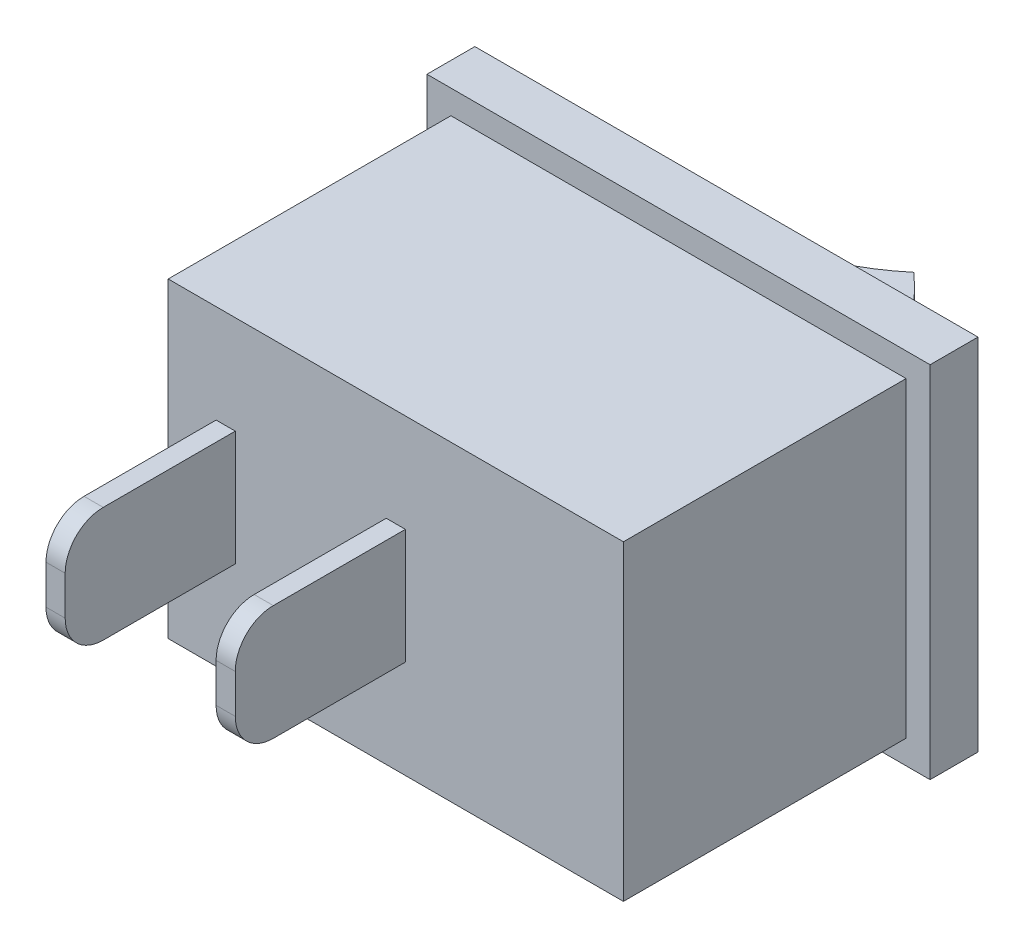
ISO-10303-21;
HEADER;
FILE_DESCRIPTION(('STEP AP214'),'2;1');
FILE_NAME('part.step','',(''),(''),'','','');
FILE_SCHEMA(('AUTOMOTIVE_DESIGN { 1 0 10303 214 1 1 1 1 }'));
ENDSEC;
DATA;
#1=APPLICATION_CONTEXT('core data for automotive mechanical design processes');
#2=APPLICATION_PROTOCOL_DEFINITION('international standard','automotive_design',2000,#1);
#3=PRODUCT_CONTEXT('',#1,'mechanical');
#4=PRODUCT('Part','Part','',(#3));
#5=PRODUCT_RELATED_PRODUCT_CATEGORY('part','',(#4));
#6=PRODUCT_DEFINITION_FORMATION('','',#4);
#7=PRODUCT_DEFINITION_CONTEXT('part definition',#1,'design');
#8=PRODUCT_DEFINITION('design','',#6,#7);
#9=PRODUCT_DEFINITION_SHAPE('','',#8);
#10=(LENGTH_UNIT() NAMED_UNIT(*) SI_UNIT(.MILLI.,.METRE.));
#11=(NAMED_UNIT(*) PLANE_ANGLE_UNIT() SI_UNIT($,.RADIAN.));
#12=(NAMED_UNIT(*) SI_UNIT($,.STERADIAN.) SOLID_ANGLE_UNIT());
#13=UNCERTAINTY_MEASURE_WITH_UNIT(LENGTH_MEASURE(1.E-05),#10,'distance_accuracy_value','');
#14=(GEOMETRIC_REPRESENTATION_CONTEXT(3) GLOBAL_UNCERTAINTY_ASSIGNED_CONTEXT((#13)) GLOBAL_UNIT_ASSIGNED_CONTEXT((#10,
#11,#12)) REPRESENTATION_CONTEXT('',''));
#15=CARTESIAN_POINT('',(0.,0.,0.));
#16=DIRECTION('',(0.,0.,1.));
#17=DIRECTION('',(1.,0.,0.));
#18=AXIS2_PLACEMENT_3D('',#15,#16,#17);
#19=CARTESIAN_POINT('',(0.,0.,13.8));
#20=DIRECTION('',(0.,0.,1.));
#21=DIRECTION('',(1.,0.,0.));
#22=AXIS2_PLACEMENT_3D('',#19,#20,#21);
#23=PLANE('',#22);
#24=DIRECTION('',(0.,-1.,0.));
#25=VECTOR('',#24,1.);
#26=CARTESIAN_POINT('',(1.,14.,13.8));
#27=LINE('',#26,#25);
#28=CARTESIAN_POINT('',(1.,14.,13.8));
#29=VERTEX_POINT('',#28);
#30=CARTESIAN_POINT('',(1.00000000000001,0.999999999999999,13.8));
#31=VERTEX_POINT('',#30);
#32=EDGE_CURVE('E277',#29,#31,#27,.T.);
#33=ORIENTED_EDGE('',*,*,#32,.T.);
#34=DIRECTION('',(1.,0.,0.));
#35=VECTOR('',#34,1.);
#36=CARTESIAN_POINT('',(1.00000000000001,0.999999999999999,13.8));
#37=LINE('',#36,#35);
#38=CARTESIAN_POINT('',(20.,1.00000000000001,13.8));
#39=VERTEX_POINT('',#38);
#40=EDGE_CURVE('E281',#31,#39,#37,.T.);
#41=ORIENTED_EDGE('',*,*,#40,.T.);
#42=DIRECTION('',(0.,1.,0.));
#43=VECTOR('',#42,1.);
#44=CARTESIAN_POINT('',(20.,14.,13.8));
#45=LINE('',#44,#43);
#46=CARTESIAN_POINT('',(20.,14.,13.8));
#47=VERTEX_POINT('',#46);
#48=EDGE_CURVE('E285',#39,#47,#45,.T.);
#49=ORIENTED_EDGE('',*,*,#48,.T.);
#50=DIRECTION('',(-1.,0.,0.));
#51=VECTOR('',#50,1.);
#52=CARTESIAN_POINT('',(1.,14.,13.8));
#53=LINE('',#52,#51);
#54=EDGE_CURVE('E288',#47,#29,#53,.T.);
#55=ORIENTED_EDGE('',*,*,#54,.T.);
#56=EDGE_LOOP('',(#33,#41,#49,#55));
#57=FACE_BOUND('',#56,.T.);
#58=DIRECTION('',(1.,0.,0.));
#59=VECTOR('',#58,1.);
#60=CARTESIAN_POINT('',(3.,5.1,13.8));
#61=LINE('',#60,#59);
#62=CARTESIAN_POINT('',(3.,5.1,13.8));
#63=VERTEX_POINT('',#62);
#64=CARTESIAN_POINT('',(3.8,5.1,13.8));
#65=VERTEX_POINT('',#64);
#66=EDGE_CURVE('E254',#63,#65,#61,.T.);
#67=ORIENTED_EDGE('',*,*,#66,.F.);
#68=DIRECTION('',(0.,-1.,0.));
#69=VECTOR('',#68,1.);
#70=CARTESIAN_POINT('',(3.,9.9,13.8));
#71=LINE('',#70,#69);
#72=CARTESIAN_POINT('',(3.,9.9,13.8));
#73=VERTEX_POINT('',#72);
#74=EDGE_CURVE('E207',#73,#63,#71,.T.);
#75=ORIENTED_EDGE('',*,*,#74,.F.);
#76=DIRECTION('',(-1.,0.,0.));
#77=VECTOR('',#76,1.);
#78=CARTESIAN_POINT('',(3.,9.9,13.8));
#79=LINE('',#78,#77);
#80=CARTESIAN_POINT('',(3.8,9.9,13.8));
#81=VERTEX_POINT('',#80);
#82=EDGE_CURVE('E246',#81,#73,#79,.T.);
#83=ORIENTED_EDGE('',*,*,#82,.F.);
#84=DIRECTION('',(0.,1.,0.));
#85=VECTOR('',#84,1.);
#86=CARTESIAN_POINT('',(3.8,9.9,13.8));
#87=LINE('',#86,#85);
#88=EDGE_CURVE('E258',#65,#81,#87,.T.);
#89=ORIENTED_EDGE('',*,*,#88,.F.);
#90=EDGE_LOOP('',(#67,#75,#83,#89));
#91=FACE_BOUND('',#90,.T.);
#92=DIRECTION('',(1.,0.,0.));
#93=VECTOR('',#92,1.);
#94=CARTESIAN_POINT('',(10.1,5.1,13.8));
#95=LINE('',#94,#93);
#96=CARTESIAN_POINT('',(10.1,5.1,13.8));
#97=VERTEX_POINT('',#96);
#98=CARTESIAN_POINT('',(10.9,5.1,13.8));
#99=VERTEX_POINT('',#98);
#100=EDGE_CURVE('E200',#97,#99,#95,.T.);
#101=ORIENTED_EDGE('',*,*,#100,.F.);
#102=DIRECTION('',(0.,-1.,0.));
#103=VECTOR('',#102,1.);
#104=CARTESIAN_POINT('',(10.1,9.9,13.8));
#105=LINE('',#104,#103);
#106=CARTESIAN_POINT('',(10.1,9.9,13.8));
#107=VERTEX_POINT('',#106);
#108=EDGE_CURVE('E211',#107,#97,#105,.T.);
#109=ORIENTED_EDGE('',*,*,#108,.F.);
#110=DIRECTION('',(-1.,0.,0.));
#111=VECTOR('',#110,1.);
#112=CARTESIAN_POINT('',(10.1,9.9,13.8));
#113=LINE('',#112,#111);
#114=CARTESIAN_POINT('',(10.9,9.9,13.8));
#115=VERTEX_POINT('',#114);
#116=EDGE_CURVE('E226',#115,#107,#113,.T.);
#117=ORIENTED_EDGE('',*,*,#116,.F.);
#118=DIRECTION('',(0.,1.,0.));
#119=VECTOR('',#118,1.);
#120=CARTESIAN_POINT('',(10.9,9.9,13.8));
#121=LINE('',#120,#119);
#122=EDGE_CURVE('E222',#99,#115,#121,.T.);
#123=ORIENTED_EDGE('',*,*,#122,.F.);
#124=EDGE_LOOP('',(#101,#109,#117,#123));
#125=FACE_BOUND('',#124,.T.);
#126=ADVANCED_FACE('F39',(#57,#91,#125),#23,.T.);
#127=CARTESIAN_POINT('',(0.,0.,2.));
#128=DIRECTION('',(0.,0.,-1.));
#129=DIRECTION('',(-1.,0.,0.));
#130=AXIS2_PLACEMENT_3D('',#127,#128,#129);
#131=PLANE('',#130);
#132=DIRECTION('',(0.,-1.,0.));
#133=VECTOR('',#132,1.);
#134=CARTESIAN_POINT('',(0.,0.,2.));
#135=LINE('',#134,#133);
#136=CARTESIAN_POINT('',(0.,15.,2.));
#137=VERTEX_POINT('',#136);
#138=CARTESIAN_POINT('',(0.,0.,2.));
#139=VERTEX_POINT('',#138);
#140=EDGE_CURVE('E452',#137,#139,#135,.T.);
#141=ORIENTED_EDGE('',*,*,#140,.T.);
#142=DIRECTION('',(1.,0.,0.));
#143=VECTOR('',#142,1.);
#144=CARTESIAN_POINT('',(0.,0.,2.));
#145=LINE('',#144,#143);
#146=CARTESIAN_POINT('',(21.,0.,2.));
#147=VERTEX_POINT('',#146);
#148=EDGE_CURVE('E456',#139,#147,#145,.T.);
#149=ORIENTED_EDGE('',*,*,#148,.T.);
#150=DIRECTION('',(0.,1.,0.));
#151=VECTOR('',#150,1.);
#152=CARTESIAN_POINT('',(21.,0.,2.));
#153=LINE('',#152,#151);
#154=CARTESIAN_POINT('',(21.,15.,2.));
#155=VERTEX_POINT('',#154);
#156=EDGE_CURVE('E460',#147,#155,#153,.T.);
#157=ORIENTED_EDGE('',*,*,#156,.T.);
#158=DIRECTION('',(-1.,0.,0.));
#159=VECTOR('',#158,1.);
#160=CARTESIAN_POINT('',(0.,15.,2.));
#161=LINE('',#160,#159);
#162=EDGE_CURVE('E463',#155,#137,#161,.T.);
#163=ORIENTED_EDGE('',*,*,#162,.T.);
#164=EDGE_LOOP('',(#141,#149,#157,#163));
#165=FACE_BOUND('',#164,.T.);
#166=DIRECTION('',(0.,-1.,0.));
#167=VECTOR('',#166,1.);
#168=CARTESIAN_POINT('',(1.,14.,2.));
#169=LINE('',#168,#167);
#170=CARTESIAN_POINT('',(1.,14.,2.));
#171=VERTEX_POINT('',#170);
#172=CARTESIAN_POINT('',(1.00000000000001,0.999999999999999,2.));
#173=VERTEX_POINT('',#172);
#174=EDGE_CURVE('E276',#171,#173,#169,.T.);
#175=ORIENTED_EDGE('',*,*,#174,.F.);
#176=DIRECTION('',(-1.,0.,0.));
#177=VECTOR('',#176,1.);
#178=CARTESIAN_POINT('',(1.,14.,2.));
#179=LINE('',#178,#177);
#180=CARTESIAN_POINT('',(20.,14.,2.));
#181=VERTEX_POINT('',#180);
#182=EDGE_CURVE('E282',#181,#171,#179,.T.);
#183=ORIENTED_EDGE('',*,*,#182,.F.);
#184=DIRECTION('',(0.,1.,0.));
#185=VECTOR('',#184,1.);
#186=CARTESIAN_POINT('',(20.,14.,2.));
#187=LINE('',#186,#185);
#188=CARTESIAN_POINT('',(20.,1.00000000000001,2.));
#189=VERTEX_POINT('',#188);
#190=EDGE_CURVE('E299',#189,#181,#187,.T.);
#191=ORIENTED_EDGE('',*,*,#190,.F.);
#192=DIRECTION('',(1.,0.,0.));
#193=VECTOR('',#192,1.);
#194=CARTESIAN_POINT('',(1.00000000000001,0.999999999999999,2.));
#195=LINE('',#194,#193);
#196=EDGE_CURVE('E295',#173,#189,#195,.T.);
#197=ORIENTED_EDGE('',*,*,#196,.F.);
#198=EDGE_LOOP('',(#175,#183,#191,#197));
#199=FACE_BOUND('',#198,.T.);
#200=ADVANCED_FACE('F347',(#165,#199),#131,.F.);
#201=CARTESIAN_POINT('',(0.,0.,0.));
#202=DIRECTION('',(0.,0.,-1.));
#203=DIRECTION('',(-1.,0.,0.));
#204=AXIS2_PLACEMENT_3D('',#201,#202,#203);
#205=PLANE('',#204);
#206=DIRECTION('',(0.,-1.,0.));
#207=VECTOR('',#206,1.);
#208=CARTESIAN_POINT('',(0.,0.,0.));
#209=LINE('',#208,#207);
#210=CARTESIAN_POINT('',(0.,15.,0.));
#211=VERTEX_POINT('',#210);
#212=CARTESIAN_POINT('',(0.,0.,0.));
#213=VERTEX_POINT('',#212);
#214=EDGE_CURVE('E451',#211,#213,#209,.T.);
#215=ORIENTED_EDGE('',*,*,#214,.F.);
#216=DIRECTION('',(-1.,0.,0.));
#217=VECTOR('',#216,1.);
#218=CARTESIAN_POINT('',(0.,15.,0.));
#219=LINE('',#218,#217);
#220=CARTESIAN_POINT('',(21.,15.,0.));
#221=VERTEX_POINT('',#220);
#222=EDGE_CURVE('E457',#221,#211,#219,.T.);
#223=ORIENTED_EDGE('',*,*,#222,.F.);
#224=DIRECTION('',(0.,1.,0.));
#225=VECTOR('',#224,1.);
#226=CARTESIAN_POINT('',(21.,0.,0.));
#227=LINE('',#226,#225);
#228=CARTESIAN_POINT('',(21.,0.,0.));
#229=VERTEX_POINT('',#228);
#230=EDGE_CURVE('E473',#229,#221,#227,.T.);
#231=ORIENTED_EDGE('',*,*,#230,.F.);
#232=DIRECTION('',(1.,0.,0.));
#233=VECTOR('',#232,1.);
#234=CARTESIAN_POINT('',(0.,0.,0.));
#235=LINE('',#234,#233);
#236=EDGE_CURVE('E470',#213,#229,#235,.T.);
#237=ORIENTED_EDGE('',*,*,#236,.F.);
#238=EDGE_LOOP('',(#215,#223,#231,#237));
#239=FACE_BOUND('',#238,.T.);
#240=DIRECTION('',(0.,1.,0.));
#241=VECTOR('',#240,1.);
#242=CARTESIAN_POINT('',(17.358,2.5,0.));
#243=LINE('',#242,#241);
#244=CARTESIAN_POINT('',(17.358,2.5,0.));
#245=VERTEX_POINT('',#244);
#246=CARTESIAN_POINT('',(17.358,12.5,0.));
#247=VERTEX_POINT('',#246);
#248=EDGE_CURVE('E435',#245,#247,#243,.T.);
#249=ORIENTED_EDGE('',*,*,#248,.T.);
#250=DIRECTION('',(-1.,0.,0.));
#251=VECTOR('',#250,1.);
#252=CARTESIAN_POINT('',(14.818,12.5,0.));
#253=LINE('',#252,#251);
#254=CARTESIAN_POINT('',(3.642,12.5,0.));
#255=VERTEX_POINT('',#254);
#256=EDGE_CURVE('E330',#247,#255,#253,.T.);
#257=ORIENTED_EDGE('',*,*,#256,.T.);
#258=DIRECTION('',(0.,1.,0.));
#259=VECTOR('',#258,1.);
#260=CARTESIAN_POINT('',(3.642,2.5,0.));
#261=LINE('',#260,#259);
#262=CARTESIAN_POINT('',(3.642,2.5,0.));
#263=VERTEX_POINT('',#262);
#264=EDGE_CURVE('E433',#263,#255,#261,.T.);
#265=ORIENTED_EDGE('',*,*,#264,.F.);
#266=DIRECTION('',(-1.,0.,0.));
#267=VECTOR('',#266,1.);
#268=CARTESIAN_POINT('',(14.818,2.5,0.));
#269=LINE('',#268,#267);
#270=EDGE_CURVE('E445',#245,#263,#269,.T.);
#271=ORIENTED_EDGE('',*,*,#270,.F.);
#272=EDGE_LOOP('',(#249,#257,#265,#271));
#273=FACE_BOUND('',#272,.T.);
#274=ADVANCED_FACE('F350',(#239,#273),#205,.T.);
#275=CARTESIAN_POINT('',(0.,0.,2.));
#276=DIRECTION('',(1.,0.,0.));
#277=DIRECTION('',(0.,0.,-1.));
#278=AXIS2_PLACEMENT_3D('',#275,#276,#277);
#279=PLANE('',#278);
#280=ORIENTED_EDGE('',*,*,#214,.T.);
#281=DIRECTION('',(0.,0.,-1.));
#282=VECTOR('',#281,1.);
#283=CARTESIAN_POINT('',(0.,0.,2.));
#284=LINE('',#283,#282);
#285=EDGE_CURVE('E489',#139,#213,#284,.T.);
#286=ORIENTED_EDGE('',*,*,#285,.F.);
#287=ORIENTED_EDGE('',*,*,#140,.F.);
#288=DIRECTION('',(0.,0.,-1.));
#289=VECTOR('',#288,1.);
#290=CARTESIAN_POINT('',(0.,15.,2.));
#291=LINE('',#290,#289);
#292=EDGE_CURVE('E466',#137,#211,#291,.T.);
#293=ORIENTED_EDGE('',*,*,#292,.T.);
#294=EDGE_LOOP('',(#280,#286,#287,#293));
#295=FACE_BOUND('',#294,.T.);
#296=ADVANCED_FACE('F354',(#295),#279,.F.);
#297=CARTESIAN_POINT('',(0.,0.,2.));
#298=DIRECTION('',(0.,1.,0.));
#299=DIRECTION('',(0.,0.,1.));
#300=AXIS2_PLACEMENT_3D('',#297,#298,#299);
#301=PLANE('',#300);
#302=ORIENTED_EDGE('',*,*,#236,.T.);
#303=DIRECTION('',(0.,0.,-1.));
#304=VECTOR('',#303,1.);
#305=CARTESIAN_POINT('',(21.,0.,2.));
#306=LINE('',#305,#304);
#307=EDGE_CURVE('E485',#147,#229,#306,.T.);
#308=ORIENTED_EDGE('',*,*,#307,.F.);
#309=ORIENTED_EDGE('',*,*,#148,.F.);
#310=ORIENTED_EDGE('',*,*,#285,.T.);
#311=EDGE_LOOP('',(#302,#308,#309,#310));
#312=FACE_BOUND('',#311,.T.);
#313=ADVANCED_FACE('F362',(#312),#301,.F.);
#314=CARTESIAN_POINT('',(21.,0.,2.));
#315=DIRECTION('',(-1.,0.,0.));
#316=DIRECTION('',(0.,0.,1.));
#317=AXIS2_PLACEMENT_3D('',#314,#315,#316);
#318=PLANE('',#317);
#319=ORIENTED_EDGE('',*,*,#230,.T.);
#320=DIRECTION('',(0.,0.,-1.));
#321=VECTOR('',#320,1.);
#322=CARTESIAN_POINT('',(21.,15.,2.));
#323=LINE('',#322,#321);
#324=EDGE_CURVE('E481',#155,#221,#323,.T.);
#325=ORIENTED_EDGE('',*,*,#324,.F.);
#326=ORIENTED_EDGE('',*,*,#156,.F.);
#327=ORIENTED_EDGE('',*,*,#307,.T.);
#328=EDGE_LOOP('',(#319,#325,#326,#327));
#329=FACE_BOUND('',#328,.T.);
#330=ADVANCED_FACE('F358',(#329),#318,.F.);
#331=CARTESIAN_POINT('',(0.,15.,2.));
#332=DIRECTION('',(0.,-1.,0.));
#333=DIRECTION('',(0.,0.,-1.));
#334=AXIS2_PLACEMENT_3D('',#331,#332,#333);
#335=PLANE('',#334);
#336=ORIENTED_EDGE('',*,*,#222,.T.);
#337=ORIENTED_EDGE('',*,*,#292,.F.);
#338=ORIENTED_EDGE('',*,*,#162,.F.);
#339=ORIENTED_EDGE('',*,*,#324,.T.);
#340=EDGE_LOOP('',(#336,#337,#338,#339));
#341=FACE_BOUND('',#340,.T.);
#342=ADVANCED_FACE('F344',(#341),#335,.F.);
#343=CARTESIAN_POINT('',(3.642,2.5,0.));
#344=CARTESIAN_POINT('',(7.96456924620145,2.5,-0.39213264449788));
#345=CARTESIAN_POINT('',(12.3128402722053,2.5,-1.3710891007199));
#346=CARTESIAN_POINT('',(14.818,2.5,-3.5));
#347=B_SPLINE_CURVE_WITH_KNOTS('',3,(#343,#344,#345,#346),.UNSPECIFIED.,.F.,.F.,(4,4),(0.,1.),.UNSPECIFIED.);
#348=DIRECTION('',(0.,1.,0.));
#349=VECTOR('',#348,1.);
#350=SURFACE_OF_LINEAR_EXTRUSION('',#347,#349);
#351=CARTESIAN_POINT('',(3.642,12.5,0.));
#352=CARTESIAN_POINT('',(7.96456924620145,12.5,-0.39213264449788));
#353=CARTESIAN_POINT('',(12.3128402722053,12.5,-1.3710891007199));
#354=CARTESIAN_POINT('',(14.818,12.5,-3.5));
#355=B_SPLINE_CURVE_WITH_KNOTS('',3,(#351,#352,#353,#354),.UNSPECIFIED.,.F.,.F.,(4,4),(0.,1.),.UNSPECIFIED.);
#356=CARTESIAN_POINT('',(14.818,12.5,-3.5));
#357=VERTEX_POINT('',#356);
#358=EDGE_CURVE('E321',#255,#357,#355,.T.);
#359=ORIENTED_EDGE('',*,*,#358,.T.);
#360=DIRECTION('',(0.,1.,0.));
#361=VECTOR('',#360,1.);
#362=CARTESIAN_POINT('',(14.818,2.5,-3.5));
#363=LINE('',#362,#361);
#364=CARTESIAN_POINT('',(14.818,2.5,-3.5));
#365=VERTEX_POINT('',#364);
#366=EDGE_CURVE('E448',#365,#357,#363,.T.);
#367=ORIENTED_EDGE('',*,*,#366,.F.);
#368=EDGE_CURVE('E322',#263,#365,#347,.T.);
#369=ORIENTED_EDGE('',*,*,#368,.F.);
#370=ORIENTED_EDGE('',*,*,#264,.T.);
#371=EDGE_LOOP('',(#359,#367,#369,#370));
#372=FACE_BOUND('',#371,.T.);
#373=ADVANCED_FACE('F339',(#372),#350,.F.);
#374=CARTESIAN_POINT('',(14.818,2.5,-3.5));
#375=CARTESIAN_POINT('',(16.7076823863501,2.5,-1.83958849519858));
#376=CARTESIAN_POINT('',(17.358,2.5,0.));
#377=B_SPLINE_CURVE_WITH_KNOTS('',2,(#374,#375,#376),.UNSPECIFIED.,.F.,.F.,(3,3),(0.,1.),.UNSPECIFIED.);
#378=DIRECTION('',(0.,1.,0.));
#379=VECTOR('',#378,1.);
#380=SURFACE_OF_LINEAR_EXTRUSION('',#377,#379);
#381=CARTESIAN_POINT('',(14.818,12.5,-3.5));
#382=CARTESIAN_POINT('',(16.7076823863501,12.5,-1.83958849519858));
#383=CARTESIAN_POINT('',(17.358,12.5,0.));
#384=B_SPLINE_CURVE_WITH_KNOTS('',2,(#381,#382,#383),.UNSPECIFIED.,.F.,.F.,(3,3),(0.,1.),.UNSPECIFIED.);
#385=EDGE_CURVE('E425',#357,#247,#384,.T.);
#386=ORIENTED_EDGE('',*,*,#385,.T.);
#387=ORIENTED_EDGE('',*,*,#248,.F.);
#388=EDGE_CURVE('E329',#365,#245,#377,.T.);
#389=ORIENTED_EDGE('',*,*,#388,.F.);
#390=ORIENTED_EDGE('',*,*,#366,.T.);
#391=EDGE_LOOP('',(#386,#387,#389,#390));
#392=FACE_BOUND('',#391,.T.);
#393=ADVANCED_FACE('F343',(#392),#380,.F.);
#394=CARTESIAN_POINT('',(9.91152856940251,2.5,-1.09870815445667));
#395=DIRECTION('',(0.,1.,0.));
#396=DIRECTION('',(0.,0.,1.));
#397=AXIS2_PLACEMENT_3D('',#394,#395,#396);
#398=PLANE('',#397);
#399=ORIENTED_EDGE('',*,*,#368,.T.);
#400=ORIENTED_EDGE('',*,*,#388,.T.);
#401=ORIENTED_EDGE('',*,*,#270,.T.);
#402=EDGE_LOOP('',(#399,#400,#401));
#403=FACE_BOUND('',#402,.T.);
#404=ADVANCED_FACE('F413',(#403),#398,.F.);
#405=CARTESIAN_POINT('',(9.91152856940251,12.5,-1.09870815445667));
#406=DIRECTION('',(0.,1.,0.));
#407=DIRECTION('',(0.,0.,1.));
#408=AXIS2_PLACEMENT_3D('',#405,#406,#407);
#409=PLANE('',#408);
#410=ORIENTED_EDGE('',*,*,#358,.F.);
#411=ORIENTED_EDGE('',*,*,#256,.F.);
#412=ORIENTED_EDGE('',*,*,#385,.F.);
#413=EDGE_LOOP('',(#410,#411,#412));
#414=FACE_BOUND('',#413,.T.);
#415=ADVANCED_FACE('F411',(#414),#409,.T.);
#416=CARTESIAN_POINT('',(1.,14.,13.8));
#417=DIRECTION('',(1.,0.,0.));
#418=DIRECTION('',(0.,1.,0.));
#419=AXIS2_PLACEMENT_3D('',#416,#417,#418);
#420=PLANE('',#419);
#421=ORIENTED_EDGE('',*,*,#174,.T.);
#422=DIRECTION('',(0.,0.,-1.));
#423=VECTOR('',#422,1.);
#424=CARTESIAN_POINT('',(1.00000000000001,0.999999999999999,13.8));
#425=LINE('',#424,#423);
#426=EDGE_CURVE('E317',#31,#173,#425,.T.);
#427=ORIENTED_EDGE('',*,*,#426,.F.);
#428=ORIENTED_EDGE('',*,*,#32,.F.);
#429=DIRECTION('',(0.,0.,-1.));
#430=VECTOR('',#429,1.);
#431=CARTESIAN_POINT('',(1.,14.,13.8));
#432=LINE('',#431,#430);
#433=EDGE_CURVE('E291',#29,#171,#432,.T.);
#434=ORIENTED_EDGE('',*,*,#433,.T.);
#435=EDGE_LOOP('',(#421,#427,#428,#434));
#436=FACE_BOUND('',#435,.T.);
#437=ADVANCED_FACE('F407',(#436),#420,.F.);
#438=CARTESIAN_POINT('',(1.00000000000001,0.999999999999999,13.8));
#439=DIRECTION('',(0.,1.,0.));
#440=DIRECTION('',(-1.,0.,0.));
#441=AXIS2_PLACEMENT_3D('',#438,#439,#440);
#442=PLANE('',#441);
#443=ORIENTED_EDGE('',*,*,#196,.T.);
#444=DIRECTION('',(0.,0.,-1.));
#445=VECTOR('',#444,1.);
#446=CARTESIAN_POINT('',(20.,1.00000000000001,13.8));
#447=LINE('',#446,#445);
#448=EDGE_CURVE('E313',#39,#189,#447,.T.);
#449=ORIENTED_EDGE('',*,*,#448,.F.);
#450=ORIENTED_EDGE('',*,*,#40,.F.);
#451=ORIENTED_EDGE('',*,*,#426,.T.);
#452=EDGE_LOOP('',(#443,#449,#450,#451));
#453=FACE_BOUND('',#452,.T.);
#454=ADVANCED_FACE('F403',(#453),#442,.F.);
#455=CARTESIAN_POINT('',(20.,14.,13.8));
#456=DIRECTION('',(-1.,0.,0.));
#457=DIRECTION('',(0.,-1.,0.));
#458=AXIS2_PLACEMENT_3D('',#455,#456,#457);
#459=PLANE('',#458);
#460=ORIENTED_EDGE('',*,*,#190,.T.);
#461=DIRECTION('',(0.,0.,-1.));
#462=VECTOR('',#461,1.);
#463=CARTESIAN_POINT('',(20.,14.,13.8));
#464=LINE('',#463,#462);
#465=EDGE_CURVE('E309',#47,#181,#464,.T.);
#466=ORIENTED_EDGE('',*,*,#465,.F.);
#467=ORIENTED_EDGE('',*,*,#48,.F.);
#468=ORIENTED_EDGE('',*,*,#448,.T.);
#469=EDGE_LOOP('',(#460,#466,#467,#468));
#470=FACE_BOUND('',#469,.T.);
#471=ADVANCED_FACE('F399',(#470),#459,.F.);
#472=CARTESIAN_POINT('',(1.,14.,13.8));
#473=DIRECTION('',(0.,-1.,0.));
#474=DIRECTION('',(0.,0.,-1.));
#475=AXIS2_PLACEMENT_3D('',#472,#473,#474);
#476=PLANE('',#475);
#477=ORIENTED_EDGE('',*,*,#182,.T.);
#478=ORIENTED_EDGE('',*,*,#433,.F.);
#479=ORIENTED_EDGE('',*,*,#54,.F.);
#480=ORIENTED_EDGE('',*,*,#465,.T.);
#481=EDGE_LOOP('',(#477,#478,#479,#480));
#482=FACE_BOUND('',#481,.T.);
#483=ADVANCED_FACE('F396',(#482),#476,.F.);
#484=CARTESIAN_POINT('',(3.,9.9,20.9));
#485=DIRECTION('',(1.,0.,0.));
#486=DIRECTION('',(0.,1.,0.));
#487=AXIS2_PLACEMENT_3D('',#484,#485,#486);
#488=PLANE('',#487);
#489=DIRECTION('',(0.,0.,-1.));
#490=VECTOR('',#489,1.);
#491=CARTESIAN_POINT('',(3.,5.1,20.9));
#492=LINE('',#491,#490);
#493=CARTESIAN_POINT('',(3.,5.1,19.3125));
#494=VERTEX_POINT('',#493);
#495=EDGE_CURVE('E273',#494,#63,#492,.T.);
#496=ORIENTED_EDGE('',*,*,#495,.F.);
#497=CARTESIAN_POINT('',(3.,6.6875,19.3125));
#498=DIRECTION('',(1.,0.,0.));
#499=DIRECTION('',(0.,1.,0.));
#500=AXIS2_PLACEMENT_3D('',#497,#498,#499);
#501=CIRCLE('',#500,1.5875);
#502=CARTESIAN_POINT('',(3.,6.6875,20.9));
#503=VERTEX_POINT('',#502);
#504=EDGE_CURVE('E48',#494,#503,#501,.F.);
#505=ORIENTED_EDGE('',*,*,#504,.T.);
#506=DIRECTION('',(0.,-1.,0.));
#507=VECTOR('',#506,1.);
#508=CARTESIAN_POINT('',(3.,9.9,20.9));
#509=LINE('',#508,#507);
#510=CARTESIAN_POINT('',(3.,8.3125,20.9));
#511=VERTEX_POINT('',#510);
#512=EDGE_CURVE('E241',#511,#503,#509,.T.);
#513=ORIENTED_EDGE('',*,*,#512,.F.);
#514=CARTESIAN_POINT('',(3.,8.3125,19.3125));
#515=DIRECTION('',(1.,0.,0.));
#516=DIRECTION('',(0.,1.,0.));
#517=AXIS2_PLACEMENT_3D('',#514,#515,#516);
#518=CIRCLE('',#517,1.5875);
#519=CARTESIAN_POINT('',(3.,9.9,19.3125));
#520=VERTEX_POINT('',#519);
#521=EDGE_CURVE('E55',#511,#520,#518,.F.);
#522=ORIENTED_EDGE('',*,*,#521,.T.);
#523=DIRECTION('',(0.,0.,-1.));
#524=VECTOR('',#523,1.);
#525=CARTESIAN_POINT('',(3.,9.9,20.9));
#526=LINE('',#525,#524);
#527=EDGE_CURVE('E250',#520,#73,#526,.T.);
#528=ORIENTED_EDGE('',*,*,#527,.T.);
#529=ORIENTED_EDGE('',*,*,#74,.T.);
#530=EDGE_LOOP('',(#496,#505,#513,#522,#528,#529));
#531=FACE_BOUND('',#530,.T.);
#532=ADVANCED_FACE('F394',(#531),#488,.F.);
#533=CARTESIAN_POINT('',(3.,5.1,20.9));
#534=DIRECTION('',(0.,1.,0.));
#535=DIRECTION('',(0.,0.,1.));
#536=AXIS2_PLACEMENT_3D('',#533,#534,#535);
#537=PLANE('',#536);
#538=DIRECTION('',(0.,0.,-1.));
#539=VECTOR('',#538,1.);
#540=CARTESIAN_POINT('',(3.8,5.1,20.9));
#541=LINE('',#540,#539);
#542=CARTESIAN_POINT('',(3.8,5.1,19.3125));
#543=VERTEX_POINT('',#542);
#544=EDGE_CURVE('E270',#543,#65,#541,.T.);
#545=ORIENTED_EDGE('',*,*,#544,.F.);
#546=DIRECTION('',(1.,0.,0.));
#547=VECTOR('',#546,1.);
#548=CARTESIAN_POINT('',(3.,5.1,19.3125));
#549=LINE('',#548,#547);
#550=EDGE_CURVE('E63',#543,#494,#549,.F.);
#551=ORIENTED_EDGE('',*,*,#550,.T.);
#552=ORIENTED_EDGE('',*,*,#495,.T.);
#553=ORIENTED_EDGE('',*,*,#66,.T.);
#554=EDGE_LOOP('',(#545,#551,#552,#553));
#555=FACE_BOUND('',#554,.T.);
#556=ADVANCED_FACE('F543',(#555),#537,.F.);
#557=CARTESIAN_POINT('',(3.8,9.9,20.9));
#558=DIRECTION('',(-1.,0.,0.));
#559=DIRECTION('',(0.,-1.,0.));
#560=AXIS2_PLACEMENT_3D('',#557,#558,#559);
#561=PLANE('',#560);
#562=DIRECTION('',(0.,1.,0.));
#563=VECTOR('',#562,1.);
#564=CARTESIAN_POINT('',(3.8,9.9,20.9));
#565=LINE('',#564,#563);
#566=CARTESIAN_POINT('',(3.8,6.6875,20.9));
#567=VERTEX_POINT('',#566);
#568=CARTESIAN_POINT('',(3.8,8.3125,20.9));
#569=VERTEX_POINT('',#568);
#570=EDGE_CURVE('E245',#567,#569,#565,.T.);
#571=ORIENTED_EDGE('',*,*,#570,.F.);
#572=CARTESIAN_POINT('',(3.8,6.6875,19.3125));
#573=DIRECTION('',(-1.,0.,0.));
#574=DIRECTION('',(0.,-1.,0.));
#575=AXIS2_PLACEMENT_3D('',#572,#573,#574);
#576=CIRCLE('',#575,1.5875);
#577=EDGE_CURVE('E529',#567,#543,#576,.F.);
#578=ORIENTED_EDGE('',*,*,#577,.T.);
#579=ORIENTED_EDGE('',*,*,#544,.T.);
#580=ORIENTED_EDGE('',*,*,#88,.T.);
#581=DIRECTION('',(0.,0.,-1.));
#582=VECTOR('',#581,1.);
#583=CARTESIAN_POINT('',(3.8,9.9,20.9));
#584=LINE('',#583,#582);
#585=CARTESIAN_POINT('',(3.8,9.9,19.3125));
#586=VERTEX_POINT('',#585);
#587=EDGE_CURVE('E267',#586,#81,#584,.T.);
#588=ORIENTED_EDGE('',*,*,#587,.F.);
#589=CARTESIAN_POINT('',(3.8,8.3125,19.3125));
#590=DIRECTION('',(-1.,0.,0.));
#591=DIRECTION('',(0.,-1.,0.));
#592=AXIS2_PLACEMENT_3D('',#589,#590,#591);
#593=CIRCLE('',#592,1.5875);
#594=EDGE_CURVE('E526',#586,#569,#593,.F.);
#595=ORIENTED_EDGE('',*,*,#594,.T.);
#596=EDGE_LOOP('',(#571,#578,#579,#580,#588,#595));
#597=FACE_BOUND('',#596,.T.);
#598=ADVANCED_FACE('F542',(#597),#561,.F.);
#599=CARTESIAN_POINT('',(3.,9.9,20.9));
#600=DIRECTION('',(0.,-1.,0.));
#601=DIRECTION('',(0.,0.,-1.));
#602=AXIS2_PLACEMENT_3D('',#599,#600,#601);
#603=PLANE('',#602);
#604=ORIENTED_EDGE('',*,*,#527,.F.);
#605=DIRECTION('',(-1.,0.,0.));
#606=VECTOR('',#605,1.);
#607=CARTESIAN_POINT('',(3.8,9.9,19.3125));
#608=LINE('',#607,#606);
#609=EDGE_CURVE('E11',#520,#586,#608,.F.);
#610=ORIENTED_EDGE('',*,*,#609,.T.);
#611=ORIENTED_EDGE('',*,*,#587,.T.);
#612=ORIENTED_EDGE('',*,*,#82,.T.);
#613=EDGE_LOOP('',(#604,#610,#611,#612));
#614=FACE_BOUND('',#613,.T.);
#615=ADVANCED_FACE('F552',(#614),#603,.F.);
#616=CARTESIAN_POINT('',(0.,0.,20.9));
#617=DIRECTION('',(0.,0.,1.));
#618=DIRECTION('',(1.,0.,0.));
#619=AXIS2_PLACEMENT_3D('',#616,#617,#618);
#620=PLANE('',#619);
#621=ORIENTED_EDGE('',*,*,#512,.T.);
#622=DIRECTION('',(1.,0.,0.));
#623=VECTOR('',#622,1.);
#624=CARTESIAN_POINT('',(3.8,6.6875,20.9));
#625=LINE('',#624,#623);
#626=EDGE_CURVE('E522',#503,#567,#625,.T.);
#627=ORIENTED_EDGE('',*,*,#626,.T.);
#628=ORIENTED_EDGE('',*,*,#570,.T.);
#629=DIRECTION('',(-1.,0.,0.));
#630=VECTOR('',#629,1.);
#631=CARTESIAN_POINT('',(3.,8.3125,20.9));
#632=LINE('',#631,#630);
#633=EDGE_CURVE('E518',#569,#511,#632,.T.);
#634=ORIENTED_EDGE('',*,*,#633,.T.);
#635=EDGE_LOOP('',(#621,#627,#628,#634));
#636=FACE_BOUND('',#635,.T.);
#637=ADVANCED_FACE('F538',(#636),#620,.T.);
#638=CARTESIAN_POINT('',(10.1,9.9,20.9));
#639=DIRECTION('',(1.,0.,0.));
#640=DIRECTION('',(0.,0.,-1.));
#641=AXIS2_PLACEMENT_3D('',#638,#639,#640);
#642=PLANE('',#641);
#643=DIRECTION('',(0.,-1.,0.));
#644=VECTOR('',#643,1.);
#645=CARTESIAN_POINT('',(10.1,9.9,20.9));
#646=LINE('',#645,#644);
#647=CARTESIAN_POINT('',(10.1,8.3125,20.9));
#648=VERTEX_POINT('',#647);
#649=CARTESIAN_POINT('',(10.1,6.6875,20.9));
#650=VERTEX_POINT('',#649);
#651=EDGE_CURVE('E232',#648,#650,#646,.T.);
#652=ORIENTED_EDGE('',*,*,#651,.F.);
#653=CARTESIAN_POINT('',(10.1,8.3125,19.3125));
#654=DIRECTION('',(1.,0.,0.));
#655=DIRECTION('',(0.,0.,-1.));
#656=AXIS2_PLACEMENT_3D('',#653,#654,#655);
#657=CIRCLE('',#656,1.5875);
#658=CARTESIAN_POINT('',(10.1,9.9,19.3125));
#659=VERTEX_POINT('',#658);
#660=EDGE_CURVE('E504',#648,#659,#657,.F.);
#661=ORIENTED_EDGE('',*,*,#660,.T.);
#662=DIRECTION('',(0.,0.,-1.));
#663=VECTOR('',#662,1.);
#664=CARTESIAN_POINT('',(10.1,9.9,20.9));
#665=LINE('',#664,#663);
#666=EDGE_CURVE('E215',#659,#107,#665,.T.);
#667=ORIENTED_EDGE('',*,*,#666,.T.);
#668=ORIENTED_EDGE('',*,*,#108,.T.);
#669=DIRECTION('',(0.,0.,-1.));
#670=VECTOR('',#669,1.);
#671=CARTESIAN_POINT('',(10.1,5.1,20.9));
#672=LINE('',#671,#670);
#673=CARTESIAN_POINT('',(10.1,5.1,19.3125));
#674=VERTEX_POINT('',#673);
#675=EDGE_CURVE('E195',#674,#97,#672,.T.);
#676=ORIENTED_EDGE('',*,*,#675,.F.);
#677=CARTESIAN_POINT('',(10.1,6.6875,19.3125));
#678=DIRECTION('',(1.,0.,0.));
#679=DIRECTION('',(0.,0.,-1.));
#680=AXIS2_PLACEMENT_3D('',#677,#678,#679);
#681=CIRCLE('',#680,1.5875);
#682=EDGE_CURVE('E501',#674,#650,#681,.F.);
#683=ORIENTED_EDGE('',*,*,#682,.T.);
#684=EDGE_LOOP('',(#652,#661,#667,#668,#676,#683));
#685=FACE_BOUND('',#684,.T.);
#686=ADVANCED_FACE('F213',(#685),#642,.F.);
#687=CARTESIAN_POINT('',(10.1,5.1,20.9));
#688=DIRECTION('',(0.,1.,0.));
#689=DIRECTION('',(0.,0.,1.));
#690=AXIS2_PLACEMENT_3D('',#687,#688,#689);
#691=PLANE('',#690);
#692=DIRECTION('',(0.,0.,-1.));
#693=VECTOR('',#692,1.);
#694=CARTESIAN_POINT('',(10.9,5.1,20.9));
#695=LINE('',#694,#693);
#696=CARTESIAN_POINT('',(10.9,5.1,19.3125));
#697=VERTEX_POINT('',#696);
#698=EDGE_CURVE('E208',#697,#99,#695,.T.);
#699=ORIENTED_EDGE('',*,*,#698,.F.);
#700=DIRECTION('',(1.,0.,0.));
#701=VECTOR('',#700,1.);
#702=CARTESIAN_POINT('',(10.1,5.1,19.3125));
#703=LINE('',#702,#701);
#704=EDGE_CURVE('E203',#697,#674,#703,.F.);
#705=ORIENTED_EDGE('',*,*,#704,.T.);
#706=ORIENTED_EDGE('',*,*,#675,.T.);
#707=ORIENTED_EDGE('',*,*,#100,.T.);
#708=EDGE_LOOP('',(#699,#705,#706,#707));
#709=FACE_BOUND('',#708,.T.);
#710=ADVANCED_FACE('F198',(#709),#691,.F.);
#711=CARTESIAN_POINT('',(10.9,9.9,20.9));
#712=DIRECTION('',(-1.,0.,0.));
#713=DIRECTION('',(0.,0.,1.));
#714=AXIS2_PLACEMENT_3D('',#711,#712,#713);
#715=PLANE('',#714);
#716=DIRECTION('',(0.,0.,-1.));
#717=VECTOR('',#716,1.);
#718=CARTESIAN_POINT('',(10.9,9.9,20.9));
#719=LINE('',#718,#717);
#720=CARTESIAN_POINT('',(10.9,9.9,19.3125));
#721=VERTEX_POINT('',#720);
#722=EDGE_CURVE('E235',#721,#115,#719,.T.);
#723=ORIENTED_EDGE('',*,*,#722,.F.);
#724=CARTESIAN_POINT('',(10.9,8.3125,19.3125));
#725=DIRECTION('',(-1.,0.,0.));
#726=DIRECTION('',(0.,0.,1.));
#727=AXIS2_PLACEMENT_3D('',#724,#725,#726);
#728=CIRCLE('',#727,1.5875);
#729=CARTESIAN_POINT('',(10.9,8.3125,20.9));
#730=VERTEX_POINT('',#729);
#731=EDGE_CURVE('E513',#721,#730,#728,.F.);
#732=ORIENTED_EDGE('',*,*,#731,.T.);
#733=DIRECTION('',(0.,1.,0.));
#734=VECTOR('',#733,1.);
#735=CARTESIAN_POINT('',(10.9,9.9,20.9));
#736=LINE('',#735,#734);
#737=CARTESIAN_POINT('',(10.9,6.6875,20.9));
#738=VERTEX_POINT('',#737);
#739=EDGE_CURVE('E236',#738,#730,#736,.T.);
#740=ORIENTED_EDGE('',*,*,#739,.F.);
#741=CARTESIAN_POINT('',(10.9,6.6875,19.3125));
#742=DIRECTION('',(-1.,0.,0.));
#743=DIRECTION('',(0.,0.,1.));
#744=AXIS2_PLACEMENT_3D('',#741,#742,#743);
#745=CIRCLE('',#744,1.5875);
#746=EDGE_CURVE('E510',#738,#697,#745,.F.);
#747=ORIENTED_EDGE('',*,*,#746,.T.);
#748=ORIENTED_EDGE('',*,*,#698,.T.);
#749=ORIENTED_EDGE('',*,*,#122,.T.);
#750=EDGE_LOOP('',(#723,#732,#740,#747,#748,#749));
#751=FACE_BOUND('',#750,.T.);
#752=ADVANCED_FACE('F698',(#751),#715,.F.);
#753=CARTESIAN_POINT('',(10.1,9.9,20.9));
#754=DIRECTION('',(0.,-1.,0.));
#755=DIRECTION('',(0.,0.,-1.));
#756=AXIS2_PLACEMENT_3D('',#753,#754,#755);
#757=PLANE('',#756);
#758=ORIENTED_EDGE('',*,*,#666,.F.);
#759=DIRECTION('',(-1.,0.,0.));
#760=VECTOR('',#759,1.);
#761=CARTESIAN_POINT('',(10.9,9.9,19.3125));
#762=LINE('',#761,#760);
#763=EDGE_CURVE('E507',#659,#721,#762,.F.);
#764=ORIENTED_EDGE('',*,*,#763,.T.);
#765=ORIENTED_EDGE('',*,*,#722,.T.);
#766=ORIENTED_EDGE('',*,*,#116,.T.);
#767=EDGE_LOOP('',(#758,#764,#765,#766));
#768=FACE_BOUND('',#767,.T.);
#769=ADVANCED_FACE('F706',(#768),#757,.F.);
#770=CARTESIAN_POINT('',(0.,0.,20.9));
#771=DIRECTION('',(0.,0.,1.));
#772=DIRECTION('',(1.,0.,0.));
#773=AXIS2_PLACEMENT_3D('',#770,#771,#772);
#774=PLANE('',#773);
#775=ORIENTED_EDGE('',*,*,#739,.T.);
#776=DIRECTION('',(-1.,0.,0.));
#777=VECTOR('',#776,1.);
#778=CARTESIAN_POINT('',(10.1,8.3125,20.9));
#779=LINE('',#778,#777);
#780=EDGE_CURVE('E497',#730,#648,#779,.T.);
#781=ORIENTED_EDGE('',*,*,#780,.T.);
#782=ORIENTED_EDGE('',*,*,#651,.T.);
#783=DIRECTION('',(1.,0.,0.));
#784=VECTOR('',#783,1.);
#785=CARTESIAN_POINT('',(10.9,6.6875,20.9));
#786=LINE('',#785,#784);
#787=EDGE_CURVE('E493',#650,#738,#786,.T.);
#788=ORIENTED_EDGE('',*,*,#787,.T.);
#789=EDGE_LOOP('',(#775,#781,#782,#788));
#790=FACE_BOUND('',#789,.T.);
#791=ADVANCED_FACE('F374',(#790),#774,.T.);
#792=CARTESIAN_POINT('',(0.,8.3125,19.3125));
#793=DIRECTION('',(1.,0.,0.));
#794=DIRECTION('',(0.,0.,-1.));
#795=AXIS2_PLACEMENT_3D('',#792,#793,#794);
#796=CYLINDRICAL_SURFACE('',#795,1.5875);
#797=ORIENTED_EDGE('',*,*,#731,.F.);
#798=ORIENTED_EDGE('',*,*,#763,.F.);
#799=ORIENTED_EDGE('',*,*,#660,.F.);
#800=ORIENTED_EDGE('',*,*,#780,.F.);
#801=EDGE_LOOP('',(#797,#798,#799,#800));
#802=FACE_BOUND('',#801,.T.);
#803=ADVANCED_FACE('F370',(#802),#796,.T.);
#804=CARTESIAN_POINT('',(0.,6.6875,19.3125));
#805=DIRECTION('',(-1.,0.,0.));
#806=DIRECTION('',(0.,0.,1.));
#807=AXIS2_PLACEMENT_3D('',#804,#805,#806);
#808=CYLINDRICAL_SURFACE('',#807,1.5875);
#809=ORIENTED_EDGE('',*,*,#682,.F.);
#810=ORIENTED_EDGE('',*,*,#704,.F.);
#811=ORIENTED_EDGE('',*,*,#746,.F.);
#812=ORIENTED_EDGE('',*,*,#787,.F.);
#813=EDGE_LOOP('',(#809,#810,#811,#812));
#814=FACE_BOUND('',#813,.T.);
#815=ADVANCED_FACE('F373',(#814),#808,.T.);
#816=CARTESIAN_POINT('',(0.,6.6875,19.3125));
#817=DIRECTION('',(-1.,0.,0.));
#818=DIRECTION('',(0.,0.,1.));
#819=AXIS2_PLACEMENT_3D('',#816,#817,#818);
#820=CYLINDRICAL_SURFACE('',#819,1.5875);
#821=ORIENTED_EDGE('',*,*,#504,.F.);
#822=ORIENTED_EDGE('',*,*,#550,.F.);
#823=ORIENTED_EDGE('',*,*,#577,.F.);
#824=ORIENTED_EDGE('',*,*,#626,.F.);
#825=EDGE_LOOP('',(#821,#822,#823,#824));
#826=FACE_BOUND('',#825,.T.);
#827=ADVANCED_FACE('F377',(#826),#820,.T.);
#828=CARTESIAN_POINT('',(0.,8.3125,19.3125));
#829=DIRECTION('',(1.,0.,0.));
#830=DIRECTION('',(0.,0.,-1.));
#831=AXIS2_PLACEMENT_3D('',#828,#829,#830);
#832=CYLINDRICAL_SURFACE('',#831,1.5875);
#833=ORIENTED_EDGE('',*,*,#594,.F.);
#834=ORIENTED_EDGE('',*,*,#609,.F.);
#835=ORIENTED_EDGE('',*,*,#521,.F.);
#836=ORIENTED_EDGE('',*,*,#633,.F.);
#837=EDGE_LOOP('',(#833,#834,#835,#836));
#838=FACE_BOUND('',#837,.T.);
#839=ADVANCED_FACE('F41',(#838),#832,.T.);
#840=CLOSED_SHELL('',(#126,#200,#274,#296,#313,#330,#342,#373,#393,#404,#415,#437,#454,#471,
#483,#532,#556,#598,#615,#637,#686,#710,#752,#769,#791,#803,#815,#827,#839));
#841=MANIFOLD_SOLID_BREP('B2',#840);
#842=ADVANCED_BREP_SHAPE_REPRESENTATION('',(#18,#841),#14);
#843=SHAPE_DEFINITION_REPRESENTATION(#9,#842);
ENDSEC;
END-ISO-10303-21;
